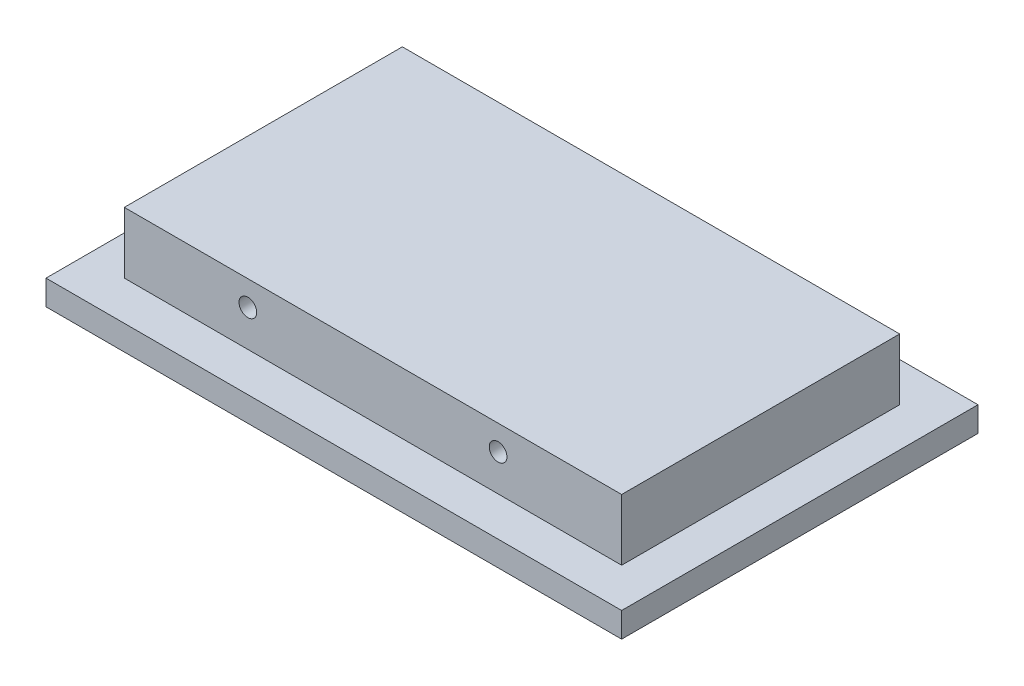
ISO-10303-21;
HEADER;
FILE_DESCRIPTION(('STEP AP214'),'2;1');
FILE_NAME('part.step','',(''),(''),'','','');
FILE_SCHEMA(('AUTOMOTIVE_DESIGN { 1 0 10303 214 1 1 1 1 }'));
ENDSEC;
DATA;
#1=APPLICATION_CONTEXT('core data for automotive mechanical design processes');
#2=APPLICATION_PROTOCOL_DEFINITION('international standard','automotive_design',2000,#1);
#3=PRODUCT_CONTEXT('',#1,'mechanical');
#4=PRODUCT('Part','Part','',(#3));
#5=PRODUCT_RELATED_PRODUCT_CATEGORY('part','',(#4));
#6=PRODUCT_DEFINITION_FORMATION('','',#4);
#7=PRODUCT_DEFINITION_CONTEXT('part definition',#1,'design');
#8=PRODUCT_DEFINITION('design','',#6,#7);
#9=PRODUCT_DEFINITION_SHAPE('','',#8);
#10=(LENGTH_UNIT() NAMED_UNIT(*) SI_UNIT(.MILLI.,.METRE.));
#11=(NAMED_UNIT(*) PLANE_ANGLE_UNIT() SI_UNIT($,.RADIAN.));
#12=(NAMED_UNIT(*) SI_UNIT($,.STERADIAN.) SOLID_ANGLE_UNIT());
#13=UNCERTAINTY_MEASURE_WITH_UNIT(LENGTH_MEASURE(1.E-05),#10,'distance_accuracy_value','');
#14=(GEOMETRIC_REPRESENTATION_CONTEXT(3) GLOBAL_UNCERTAINTY_ASSIGNED_CONTEXT((#13)) GLOBAL_UNIT_ASSIGNED_CONTEXT((#10,
#11,#12)) REPRESENTATION_CONTEXT('',''));
#15=CARTESIAN_POINT('',(0.,0.,0.));
#16=DIRECTION('',(0.,0.,1.));
#17=DIRECTION('',(1.,0.,0.));
#18=AXIS2_PLACEMENT_3D('',#15,#16,#17);
#19=CARTESIAN_POINT('',(73.5,3.175,0.));
#20=DIRECTION('',(1.,0.,0.));
#21=DIRECTION('',(0.,0.,-1.));
#22=AXIS2_PLACEMENT_3D('',#19,#20,#21);
#23=PLANE('',#22);
#24=DIRECTION('',(0.,0.,1.));
#25=VECTOR('',#24,1.);
#26=CARTESIAN_POINT('',(73.5,0.,0.));
#27=LINE('',#26,#25);
#28=CARTESIAN_POINT('',(73.5,0.,0.));
#29=VERTEX_POINT('',#28);
#30=CARTESIAN_POINT('',(73.5,0.,45.5));
#31=VERTEX_POINT('',#30);
#32=EDGE_CURVE('E123',#29,#31,#27,.T.);
#33=ORIENTED_EDGE('',*,*,#32,.F.);
#34=DIRECTION('',(0.,-1.,0.));
#35=VECTOR('',#34,1.);
#36=CARTESIAN_POINT('',(73.5,3.175,0.));
#37=LINE('',#36,#35);
#38=CARTESIAN_POINT('',(73.5,3.175,0.));
#39=VERTEX_POINT('',#38);
#40=EDGE_CURVE('E11',#39,#29,#37,.T.);
#41=ORIENTED_EDGE('',*,*,#40,.F.);
#42=DIRECTION('',(0.,0.,1.));
#43=VECTOR('',#42,1.);
#44=CARTESIAN_POINT('',(73.5,3.175,0.));
#45=LINE('',#44,#43);
#46=CARTESIAN_POINT('',(73.5,3.175,45.5));
#47=VERTEX_POINT('',#46);
#48=EDGE_CURVE('E133',#39,#47,#45,.T.);
#49=ORIENTED_EDGE('',*,*,#48,.T.);
#50=DIRECTION('',(0.,-1.,0.));
#51=VECTOR('',#50,1.);
#52=CARTESIAN_POINT('',(73.5,3.175,45.5));
#53=LINE('',#52,#51);
#54=EDGE_CURVE('E79',#47,#31,#53,.T.);
#55=ORIENTED_EDGE('',*,*,#54,.T.);
#56=EDGE_LOOP('',(#33,#41,#49,#55));
#57=FACE_BOUND('',#56,.T.);
#58=ADVANCED_FACE('F39',(#57),#23,.T.);
#59=CARTESIAN_POINT('',(0.,3.175,0.));
#60=DIRECTION('',(0.,0.,-1.));
#61=DIRECTION('',(-1.,0.,0.));
#62=AXIS2_PLACEMENT_3D('',#59,#60,#61);
#63=PLANE('',#62);
#64=DIRECTION('',(1.,0.,0.));
#65=VECTOR('',#64,1.);
#66=CARTESIAN_POINT('',(0.,0.,0.));
#67=LINE('',#66,#65);
#68=CARTESIAN_POINT('',(0.,0.,0.));
#69=VERTEX_POINT('',#68);
#70=EDGE_CURVE('E127',#69,#29,#67,.T.);
#71=ORIENTED_EDGE('',*,*,#70,.F.);
#72=DIRECTION('',(0.,-1.,0.));
#73=VECTOR('',#72,1.);
#74=CARTESIAN_POINT('',(0.,3.175,0.));
#75=LINE('',#74,#73);
#76=CARTESIAN_POINT('',(0.,3.175,0.));
#77=VERTEX_POINT('',#76);
#78=EDGE_CURVE('E47',#77,#69,#75,.T.);
#79=ORIENTED_EDGE('',*,*,#78,.F.);
#80=DIRECTION('',(1.,0.,0.));
#81=VECTOR('',#80,1.);
#82=CARTESIAN_POINT('',(0.,3.175,0.));
#83=LINE('',#82,#81);
#84=EDGE_CURVE('E135',#77,#39,#83,.T.);
#85=ORIENTED_EDGE('',*,*,#84,.T.);
#86=ORIENTED_EDGE('',*,*,#40,.T.);
#87=EDGE_LOOP('',(#71,#79,#85,#86));
#88=FACE_BOUND('',#87,.T.);
#89=ADVANCED_FACE('F158',(#88),#63,.T.);
#90=CARTESIAN_POINT('',(0.,3.175,0.));
#91=DIRECTION('',(1.,0.,0.));
#92=DIRECTION('',(0.,0.,-1.));
#93=AXIS2_PLACEMENT_3D('',#90,#91,#92);
#94=PLANE('',#93);
#95=DIRECTION('',(0.,0.,1.));
#96=VECTOR('',#95,1.);
#97=CARTESIAN_POINT('',(0.,0.,0.));
#98=LINE('',#97,#96);
#99=CARTESIAN_POINT('',(0.,0.,45.5));
#100=VERTEX_POINT('',#99);
#101=EDGE_CURVE('E71',#69,#100,#98,.T.);
#102=ORIENTED_EDGE('',*,*,#101,.T.);
#103=DIRECTION('',(0.,-1.,0.));
#104=VECTOR('',#103,1.);
#105=CARTESIAN_POINT('',(0.,3.175,45.5));
#106=LINE('',#105,#104);
#107=CARTESIAN_POINT('',(0.,3.175,45.5));
#108=VERTEX_POINT('',#107);
#109=EDGE_CURVE('E149',#108,#100,#106,.T.);
#110=ORIENTED_EDGE('',*,*,#109,.F.);
#111=DIRECTION('',(0.,0.,1.));
#112=VECTOR('',#111,1.);
#113=CARTESIAN_POINT('',(0.,3.175,0.));
#114=LINE('',#113,#112);
#115=EDGE_CURVE('E139',#77,#108,#114,.T.);
#116=ORIENTED_EDGE('',*,*,#115,.F.);
#117=ORIENTED_EDGE('',*,*,#78,.T.);
#118=EDGE_LOOP('',(#102,#110,#116,#117));
#119=FACE_BOUND('',#118,.T.);
#120=ADVANCED_FACE('F151',(#119),#94,.F.);
#121=CARTESIAN_POINT('',(0.,3.175,45.5));
#122=DIRECTION('',(0.,0.,-1.));
#123=DIRECTION('',(-1.,0.,0.));
#124=AXIS2_PLACEMENT_3D('',#121,#122,#123);
#125=PLANE('',#124);
#126=DIRECTION('',(1.,0.,0.));
#127=VECTOR('',#126,1.);
#128=CARTESIAN_POINT('',(0.,0.,45.5));
#129=LINE('',#128,#127);
#130=EDGE_CURVE('E136',#100,#31,#129,.T.);
#131=ORIENTED_EDGE('',*,*,#130,.T.);
#132=ORIENTED_EDGE('',*,*,#54,.F.);
#133=DIRECTION('',(1.,0.,0.));
#134=VECTOR('',#133,1.);
#135=CARTESIAN_POINT('',(0.,3.175,45.5));
#136=LINE('',#135,#134);
#137=EDGE_CURVE('E105',#108,#47,#136,.T.);
#138=ORIENTED_EDGE('',*,*,#137,.F.);
#139=ORIENTED_EDGE('',*,*,#109,.T.);
#140=EDGE_LOOP('',(#131,#132,#138,#139));
#141=FACE_BOUND('',#140,.T.);
#142=ADVANCED_FACE('F166',(#141),#125,.F.);
#143=CARTESIAN_POINT('',(0.,3.175,0.));
#144=DIRECTION('',(0.,1.,0.));
#145=DIRECTION('',(0.,0.,1.));
#146=AXIS2_PLACEMENT_3D('',#143,#144,#145);
#147=PLANE('',#146);
#148=ORIENTED_EDGE('',*,*,#48,.F.);
#149=ORIENTED_EDGE('',*,*,#84,.F.);
#150=ORIENTED_EDGE('',*,*,#115,.T.);
#151=ORIENTED_EDGE('',*,*,#137,.T.);
#152=EDGE_LOOP('',(#148,#149,#150,#151));
#153=FACE_BOUND('',#152,.T.);
#154=DIRECTION('',(1.,0.,0.));
#155=VECTOR('',#154,1.);
#156=CARTESIAN_POINT('',(0.,3.175,5.));
#157=LINE('',#156,#155);
#158=CARTESIAN_POINT('',(5.00000000000001,3.175,5.));
#159=VERTEX_POINT('',#158);
#160=CARTESIAN_POINT('',(68.5,3.175,5.));
#161=VERTEX_POINT('',#160);
#162=EDGE_CURVE('E96',#159,#161,#157,.T.);
#163=ORIENTED_EDGE('',*,*,#162,.T.);
#164=DIRECTION('',(0.,0.,1.));
#165=VECTOR('',#164,1.);
#166=CARTESIAN_POINT('',(68.5,3.175,0.));
#167=LINE('',#166,#165);
#168=CARTESIAN_POINT('',(68.5,3.175,40.5));
#169=VERTEX_POINT('',#168);
#170=EDGE_CURVE('E99',#161,#169,#167,.T.);
#171=ORIENTED_EDGE('',*,*,#170,.T.);
#172=DIRECTION('',(1.,0.,0.));
#173=VECTOR('',#172,1.);
#174=CARTESIAN_POINT('',(0.,3.175,40.5));
#175=LINE('',#174,#173);
#176=CARTESIAN_POINT('',(5.,3.175,40.5));
#177=VERTEX_POINT('',#176);
#178=EDGE_CURVE('E117',#177,#169,#175,.T.);
#179=ORIENTED_EDGE('',*,*,#178,.F.);
#180=DIRECTION('',(0.,0.,1.));
#181=VECTOR('',#180,1.);
#182=CARTESIAN_POINT('',(5.00000000000001,3.175,0.));
#183=LINE('',#182,#181);
#184=EDGE_CURVE('E55',#159,#177,#183,.T.);
#185=ORIENTED_EDGE('',*,*,#184,.F.);
#186=EDGE_LOOP('',(#163,#171,#179,#185));
#187=FACE_BOUND('',#186,.T.);
#188=ADVANCED_FACE('F98',(#153,#187),#147,.T.);
#189=CARTESIAN_POINT('',(0.,0.,0.));
#190=DIRECTION('',(0.,1.,0.));
#191=DIRECTION('',(0.,0.,1.));
#192=AXIS2_PLACEMENT_3D('',#189,#190,#191);
#193=PLANE('',#192);
#194=ORIENTED_EDGE('',*,*,#32,.T.);
#195=ORIENTED_EDGE('',*,*,#130,.F.);
#196=ORIENTED_EDGE('',*,*,#101,.F.);
#197=ORIENTED_EDGE('',*,*,#70,.T.);
#198=EDGE_LOOP('',(#194,#195,#196,#197));
#199=FACE_BOUND('',#198,.T.);
#200=ADVANCED_FACE('F157',(#199),#193,.F.);
#201=CARTESIAN_POINT('',(68.5,11.,0.));
#202=DIRECTION('',(1.,0.,0.));
#203=DIRECTION('',(0.,0.,-1.));
#204=AXIS2_PLACEMENT_3D('',#201,#202,#203);
#205=PLANE('',#204);
#206=DIRECTION('',(0.,-1.,0.));
#207=VECTOR('',#206,1.);
#208=CARTESIAN_POINT('',(68.5,11.,40.5));
#209=LINE('',#208,#207);
#210=CARTESIAN_POINT('',(68.5,11.,40.5));
#211=VERTEX_POINT('',#210);
#212=EDGE_CURVE('E116',#211,#169,#209,.T.);
#213=ORIENTED_EDGE('',*,*,#212,.T.);
#214=ORIENTED_EDGE('',*,*,#170,.F.);
#215=DIRECTION('',(0.,-1.,0.));
#216=VECTOR('',#215,1.);
#217=CARTESIAN_POINT('',(68.5,11.,5.));
#218=LINE('',#217,#216);
#219=CARTESIAN_POINT('',(68.5,11.,5.));
#220=VERTEX_POINT('',#219);
#221=EDGE_CURVE('E113',#220,#161,#218,.T.);
#222=ORIENTED_EDGE('',*,*,#221,.F.);
#223=DIRECTION('',(0.,0.,1.));
#224=VECTOR('',#223,1.);
#225=CARTESIAN_POINT('',(68.5,11.,0.));
#226=LINE('',#225,#224);
#227=EDGE_CURVE('E255',#220,#211,#226,.T.);
#228=ORIENTED_EDGE('',*,*,#227,.T.);
#229=EDGE_LOOP('',(#213,#214,#222,#228));
#230=FACE_BOUND('',#229,.T.);
#231=ADVANCED_FACE('F110',(#230),#205,.T.);
#232=CARTESIAN_POINT('',(0.,11.,5.));
#233=DIRECTION('',(0.,0.,-1.));
#234=DIRECTION('',(-1.,0.,0.));
#235=AXIS2_PLACEMENT_3D('',#232,#233,#234);
#236=PLANE('',#235);
#237=CARTESIAN_POINT('',(52.725,7.82500000000001,5.));
#238=DIRECTION('',(0.,0.,-1.));
#239=DIRECTION('',(-1.,0.,0.));
#240=AXIS2_PLACEMENT_3D('',#237,#238,#239);
#241=CIRCLE('',#240,1.1303);
#242=CARTESIAN_POINT('',(51.5947,7.82500000000001,5.));
#243=VERTEX_POINT('',#242);
#244=EDGE_CURVE('E233',#243,#243,#241,.T.);
#245=ORIENTED_EDGE('',*,*,#244,.F.);
#246=EDGE_LOOP('',(#245));
#247=FACE_BOUND('',#246,.T.);
#248=CARTESIAN_POINT('',(20.775,7.82500000000001,5.));
#249=DIRECTION('',(0.,0.,-1.));
#250=DIRECTION('',(-1.,0.,0.));
#251=AXIS2_PLACEMENT_3D('',#248,#249,#250);
#252=CIRCLE('',#251,1.1303);
#253=CARTESIAN_POINT('',(19.6447,7.82500000000001,5.));
#254=VERTEX_POINT('',#253);
#255=EDGE_CURVE('E235',#254,#254,#252,.T.);
#256=ORIENTED_EDGE('',*,*,#255,.F.);
#257=EDGE_LOOP('',(#256));
#258=FACE_BOUND('',#257,.T.);
#259=ORIENTED_EDGE('',*,*,#221,.T.);
#260=ORIENTED_EDGE('',*,*,#162,.F.);
#261=DIRECTION('',(0.,-1.,0.));
#262=VECTOR('',#261,1.);
#263=CARTESIAN_POINT('',(5.00000000000001,11.,5.));
#264=LINE('',#263,#262);
#265=CARTESIAN_POINT('',(5.00000000000001,11.,5.));
#266=VERTEX_POINT('',#265);
#267=EDGE_CURVE('E124',#266,#159,#264,.T.);
#268=ORIENTED_EDGE('',*,*,#267,.F.);
#269=DIRECTION('',(1.,0.,0.));
#270=VECTOR('',#269,1.);
#271=CARTESIAN_POINT('',(0.,11.,5.));
#272=LINE('',#271,#270);
#273=EDGE_CURVE('E122',#266,#220,#272,.T.);
#274=ORIENTED_EDGE('',*,*,#273,.T.);
#275=EDGE_LOOP('',(#259,#260,#268,#274));
#276=FACE_BOUND('',#275,.T.);
#277=ADVANCED_FACE('F120',(#247,#258,#276),#236,.T.);
#278=CARTESIAN_POINT('',(5.00000000000001,11.,0.));
#279=DIRECTION('',(1.,0.,0.));
#280=DIRECTION('',(0.,0.,-1.));
#281=AXIS2_PLACEMENT_3D('',#278,#279,#280);
#282=PLANE('',#281);
#283=ORIENTED_EDGE('',*,*,#184,.T.);
#284=DIRECTION('',(0.,-1.,0.));
#285=VECTOR('',#284,1.);
#286=CARTESIAN_POINT('',(5.,11.,40.5));
#287=LINE('',#286,#285);
#288=CARTESIAN_POINT('',(5.,11.,40.5));
#289=VERTEX_POINT('',#288);
#290=EDGE_CURVE('E129',#289,#177,#287,.T.);
#291=ORIENTED_EDGE('',*,*,#290,.F.);
#292=DIRECTION('',(0.,0.,1.));
#293=VECTOR('',#292,1.);
#294=CARTESIAN_POINT('',(5.00000000000001,11.,0.));
#295=LINE('',#294,#293);
#296=EDGE_CURVE('E258',#266,#289,#295,.T.);
#297=ORIENTED_EDGE('',*,*,#296,.F.);
#298=ORIENTED_EDGE('',*,*,#267,.T.);
#299=EDGE_LOOP('',(#283,#291,#297,#298));
#300=FACE_BOUND('',#299,.T.);
#301=ADVANCED_FACE('F181',(#300),#282,.F.);
#302=CARTESIAN_POINT('',(0.,11.,40.5));
#303=DIRECTION('',(0.,0.,-1.));
#304=DIRECTION('',(-1.,0.,0.));
#305=AXIS2_PLACEMENT_3D('',#302,#303,#304);
#306=PLANE('',#305);
#307=CARTESIAN_POINT('',(20.775,7.82500000000001,40.5));
#308=DIRECTION('',(0.,0.,1.));
#309=DIRECTION('',(1.,0.,0.));
#310=AXIS2_PLACEMENT_3D('',#307,#308,#309);
#311=CIRCLE('',#310,1.1303);
#312=CARTESIAN_POINT('',(21.9053,7.82500000000001,40.5));
#313=VERTEX_POINT('',#312);
#314=EDGE_CURVE('E243',#313,#313,#311,.T.);
#315=ORIENTED_EDGE('',*,*,#314,.F.);
#316=EDGE_LOOP('',(#315));
#317=FACE_BOUND('',#316,.T.);
#318=CARTESIAN_POINT('',(52.725,7.82500000000001,40.5));
#319=DIRECTION('',(0.,0.,1.));
#320=DIRECTION('',(1.,0.,0.));
#321=AXIS2_PLACEMENT_3D('',#318,#319,#320);
#322=CIRCLE('',#321,1.1303);
#323=CARTESIAN_POINT('',(53.8553,7.82500000000001,40.5));
#324=VERTEX_POINT('',#323);
#325=EDGE_CURVE('E249',#324,#324,#322,.T.);
#326=ORIENTED_EDGE('',*,*,#325,.F.);
#327=EDGE_LOOP('',(#326));
#328=FACE_BOUND('',#327,.T.);
#329=ORIENTED_EDGE('',*,*,#178,.T.);
#330=ORIENTED_EDGE('',*,*,#212,.F.);
#331=DIRECTION('',(1.,0.,0.));
#332=VECTOR('',#331,1.);
#333=CARTESIAN_POINT('',(0.,11.,40.5));
#334=LINE('',#333,#332);
#335=EDGE_CURVE('E261',#289,#211,#334,.T.);
#336=ORIENTED_EDGE('',*,*,#335,.F.);
#337=ORIENTED_EDGE('',*,*,#290,.T.);
#338=EDGE_LOOP('',(#329,#330,#336,#337));
#339=FACE_BOUND('',#338,.T.);
#340=ADVANCED_FACE('F185',(#317,#328,#339),#306,.F.);
#341=CARTESIAN_POINT('',(0.,11.,0.));
#342=DIRECTION('',(0.,1.,0.));
#343=DIRECTION('',(0.,0.,1.));
#344=AXIS2_PLACEMENT_3D('',#341,#342,#343);
#345=PLANE('',#344);
#346=ORIENTED_EDGE('',*,*,#227,.F.);
#347=ORIENTED_EDGE('',*,*,#273,.F.);
#348=ORIENTED_EDGE('',*,*,#296,.T.);
#349=ORIENTED_EDGE('',*,*,#335,.T.);
#350=EDGE_LOOP('',(#346,#347,#348,#349));
#351=FACE_BOUND('',#350,.T.);
#352=ADVANCED_FACE('F189',(#351),#345,.T.);
#353=CARTESIAN_POINT('',(52.725,7.82500000000001,32.905));
#354=DIRECTION('',(0.,0.,1.));
#355=DIRECTION('',(1.,0.,0.));
#356=AXIS2_PLACEMENT_3D('',#353,#354,#355);
#357=CONICAL_SURFACE('',#356,1.1303,1.02974425867665);
#358=CARTESIAN_POINT('',(52.725,7.82500000000001,32.2258472423132));
#359=VERTEX_POINT('',#358);
#360=VERTEX_LOOP('',#359);
#361=FACE_BOUND('',#360,.T.);
#362=CARTESIAN_POINT('',(52.725,7.82500000000001,32.905));
#363=DIRECTION('',(0.,0.,1.));
#364=DIRECTION('',(1.,0.,0.));
#365=AXIS2_PLACEMENT_3D('',#362,#363,#364);
#366=CIRCLE('',#365,1.1303);
#367=CARTESIAN_POINT('',(53.8553,7.82500000000001,32.905));
#368=VERTEX_POINT('',#367);
#369=EDGE_CURVE('E252',#368,#368,#366,.T.);
#370=ORIENTED_EDGE('',*,*,#369,.T.);
#371=EDGE_LOOP('',(#370));
#372=FACE_BOUND('',#371,.T.);
#373=ADVANCED_FACE('F193',(#361,#372),#357,.F.);
#374=CARTESIAN_POINT('',(52.725,7.82500000000001,40.5));
#375=DIRECTION('',(0.,0.,1.));
#376=DIRECTION('',(1.,0.,0.));
#377=AXIS2_PLACEMENT_3D('',#374,#375,#376);
#378=CYLINDRICAL_SURFACE('',#377,1.1303);
#379=ORIENTED_EDGE('',*,*,#369,.F.);
#380=EDGE_LOOP('',(#379));
#381=FACE_BOUND('',#380,.T.);
#382=ORIENTED_EDGE('',*,*,#325,.T.);
#383=EDGE_LOOP('',(#382));
#384=FACE_BOUND('',#383,.T.);
#385=ADVANCED_FACE('F197',(#381,#384),#378,.F.);
#386=CARTESIAN_POINT('',(20.775,7.82500000000001,32.905));
#387=DIRECTION('',(0.,0.,1.));
#388=DIRECTION('',(1.,0.,0.));
#389=AXIS2_PLACEMENT_3D('',#386,#387,#388);
#390=CONICAL_SURFACE('',#389,1.1303,1.02974425867665);
#391=CARTESIAN_POINT('',(20.775,7.82500000000001,32.2258472423132));
#392=VERTEX_POINT('',#391);
#393=VERTEX_LOOP('',#392);
#394=FACE_BOUND('',#393,.T.);
#395=CARTESIAN_POINT('',(20.775,7.82500000000001,32.905));
#396=DIRECTION('',(0.,0.,1.));
#397=DIRECTION('',(1.,0.,0.));
#398=AXIS2_PLACEMENT_3D('',#395,#396,#397);
#399=CIRCLE('',#398,1.1303);
#400=CARTESIAN_POINT('',(21.9053,7.82500000000001,32.905));
#401=VERTEX_POINT('',#400);
#402=EDGE_CURVE('E246',#401,#401,#399,.T.);
#403=ORIENTED_EDGE('',*,*,#402,.T.);
#404=EDGE_LOOP('',(#403));
#405=FACE_BOUND('',#404,.T.);
#406=ADVANCED_FACE('F201',(#394,#405),#390,.F.);
#407=CARTESIAN_POINT('',(20.775,7.82500000000001,40.5));
#408=DIRECTION('',(0.,0.,1.));
#409=DIRECTION('',(1.,0.,0.));
#410=AXIS2_PLACEMENT_3D('',#407,#408,#409);
#411=CYLINDRICAL_SURFACE('',#410,1.1303);
#412=ORIENTED_EDGE('',*,*,#402,.F.);
#413=EDGE_LOOP('',(#412));
#414=FACE_BOUND('',#413,.T.);
#415=ORIENTED_EDGE('',*,*,#314,.T.);
#416=EDGE_LOOP('',(#415));
#417=FACE_BOUND('',#416,.T.);
#418=ADVANCED_FACE('F205',(#414,#417),#411,.F.);
#419=CARTESIAN_POINT('',(20.775,7.82500000000001,12.595));
#420=DIRECTION('',(0.,0.,-1.));
#421=DIRECTION('',(-1.,0.,0.));
#422=AXIS2_PLACEMENT_3D('',#419,#420,#421);
#423=CONICAL_SURFACE('',#422,1.1303,1.02974425867665);
#424=CARTESIAN_POINT('',(20.775,7.82500000000001,13.2741527576868));
#425=VERTEX_POINT('',#424);
#426=VERTEX_LOOP('',#425);
#427=FACE_BOUND('',#426,.T.);
#428=CARTESIAN_POINT('',(20.775,7.82500000000001,12.595));
#429=DIRECTION('',(0.,0.,-1.));
#430=DIRECTION('',(-1.,0.,0.));
#431=AXIS2_PLACEMENT_3D('',#428,#429,#430);
#432=CIRCLE('',#431,1.1303);
#433=CARTESIAN_POINT('',(19.6447,7.82500000000001,12.595));
#434=VERTEX_POINT('',#433);
#435=EDGE_CURVE('E240',#434,#434,#432,.T.);
#436=ORIENTED_EDGE('',*,*,#435,.T.);
#437=EDGE_LOOP('',(#436));
#438=FACE_BOUND('',#437,.T.);
#439=ADVANCED_FACE('F209',(#427,#438),#423,.F.);
#440=CARTESIAN_POINT('',(20.775,7.82500000000001,5.));
#441=DIRECTION('',(0.,0.,-1.));
#442=DIRECTION('',(-1.,0.,0.));
#443=AXIS2_PLACEMENT_3D('',#440,#441,#442);
#444=CYLINDRICAL_SURFACE('',#443,1.1303);
#445=ORIENTED_EDGE('',*,*,#435,.F.);
#446=EDGE_LOOP('',(#445));
#447=FACE_BOUND('',#446,.T.);
#448=ORIENTED_EDGE('',*,*,#255,.T.);
#449=EDGE_LOOP('',(#448));
#450=FACE_BOUND('',#449,.T.);
#451=ADVANCED_FACE('F213',(#447,#450),#444,.F.);
#452=CARTESIAN_POINT('',(52.725,7.82500000000001,12.595));
#453=DIRECTION('',(0.,0.,-1.));
#454=DIRECTION('',(-1.,0.,0.));
#455=AXIS2_PLACEMENT_3D('',#452,#453,#454);
#456=CONICAL_SURFACE('',#455,1.1303,1.02974425867665);
#457=CARTESIAN_POINT('',(52.725,7.82500000000001,13.2741527576869));
#458=VERTEX_POINT('',#457);
#459=VERTEX_LOOP('',#458);
#460=FACE_BOUND('',#459,.T.);
#461=CARTESIAN_POINT('',(52.725,7.82500000000001,12.595));
#462=DIRECTION('',(0.,0.,-1.));
#463=DIRECTION('',(-1.,0.,0.));
#464=AXIS2_PLACEMENT_3D('',#461,#462,#463);
#465=CIRCLE('',#464,1.1303);
#466=CARTESIAN_POINT('',(51.5947,7.82500000000001,12.595));
#467=VERTEX_POINT('',#466);
#468=EDGE_CURVE('E230',#467,#467,#465,.T.);
#469=ORIENTED_EDGE('',*,*,#468,.T.);
#470=EDGE_LOOP('',(#469));
#471=FACE_BOUND('',#470,.T.);
#472=ADVANCED_FACE('F217',(#460,#471),#456,.F.);
#473=CARTESIAN_POINT('',(52.725,7.82500000000001,5.));
#474=DIRECTION('',(0.,0.,-1.));
#475=DIRECTION('',(-1.,0.,0.));
#476=AXIS2_PLACEMENT_3D('',#473,#474,#475);
#477=CYLINDRICAL_SURFACE('',#476,1.1303);
#478=ORIENTED_EDGE('',*,*,#468,.F.);
#479=EDGE_LOOP('',(#478));
#480=FACE_BOUND('',#479,.T.);
#481=ORIENTED_EDGE('',*,*,#244,.T.);
#482=EDGE_LOOP('',(#481));
#483=FACE_BOUND('',#482,.T.);
#484=ADVANCED_FACE('F221',(#480,#483),#477,.F.);
#485=CLOSED_SHELL('',(#58,#89,#120,#142,#188,#200,#231,#277,#301,#340,#352,#373,#385,#406,#418,
#439,#451,#472,#484));
#486=MANIFOLD_SOLID_BREP('B2',#485);
#487=ADVANCED_BREP_SHAPE_REPRESENTATION('',(#18,#486),#14);
#488=SHAPE_DEFINITION_REPRESENTATION(#9,#487);
ENDSEC;
END-ISO-10303-21;
